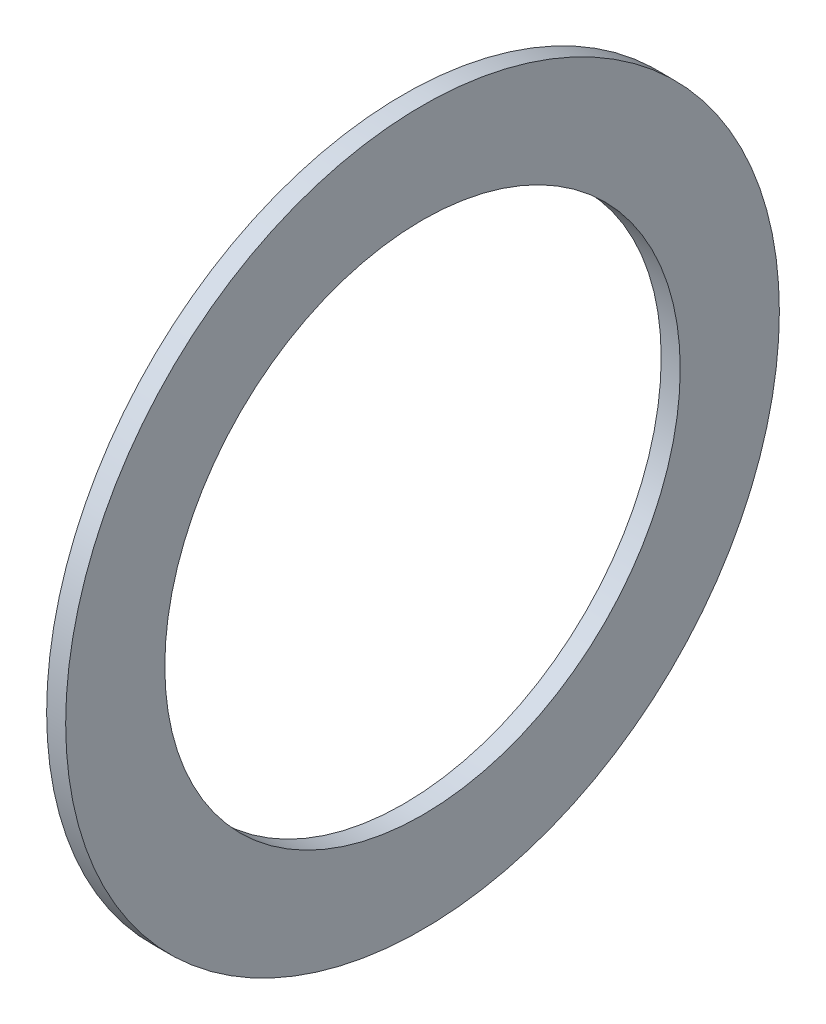
ISO-10303-21;
HEADER;
FILE_DESCRIPTION(('STEP AP214'),'2;1');
FILE_NAME('part.step','',(''),(''),'','','');
FILE_SCHEMA(('AUTOMOTIVE_DESIGN { 1 0 10303 214 1 1 1 1 }'));
ENDSEC;
DATA;
#1=APPLICATION_CONTEXT('core data for automotive mechanical design processes');
#2=APPLICATION_PROTOCOL_DEFINITION('international standard','automotive_design',2000,#1);
#3=PRODUCT_CONTEXT('',#1,'mechanical');
#4=PRODUCT('Part','Part','',(#3));
#5=PRODUCT_RELATED_PRODUCT_CATEGORY('part','',(#4));
#6=PRODUCT_DEFINITION_FORMATION('','',#4);
#7=PRODUCT_DEFINITION_CONTEXT('part definition',#1,'design');
#8=PRODUCT_DEFINITION('design','',#6,#7);
#9=PRODUCT_DEFINITION_SHAPE('','',#8);
#10=(LENGTH_UNIT() NAMED_UNIT(*) SI_UNIT(.MILLI.,.METRE.));
#11=(NAMED_UNIT(*) PLANE_ANGLE_UNIT() SI_UNIT($,.RADIAN.));
#12=(NAMED_UNIT(*) SI_UNIT($,.STERADIAN.) SOLID_ANGLE_UNIT());
#13=UNCERTAINTY_MEASURE_WITH_UNIT(LENGTH_MEASURE(1.E-05),#10,'distance_accuracy_value','');
#14=(GEOMETRIC_REPRESENTATION_CONTEXT(3) GLOBAL_UNCERTAINTY_ASSIGNED_CONTEXT((#13)) GLOBAL_UNIT_ASSIGNED_CONTEXT((#10,
#11,#12)) REPRESENTATION_CONTEXT('',''));
#15=CARTESIAN_POINT('',(0.,0.,0.));
#16=DIRECTION('',(0.,0.,1.));
#17=DIRECTION('',(1.,0.,0.));
#18=AXIS2_PLACEMENT_3D('',#15,#16,#17);
#19=CARTESIAN_POINT('',(1.2,-45.4986197219598,45.));
#20=DIRECTION('',(1.,0.,0.));
#21=DIRECTION('',(0.,0.,-1.));
#22=AXIS2_PLACEMENT_3D('',#19,#20,#21);
#23=PLANE('',#22);
#24=CARTESIAN_POINT('',(1.2,0.,0.));
#25=DIRECTION('',(1.,0.,0.));
#26=DIRECTION('',(0.,-1.1684785287495E-09,1.));
#27=AXIS2_PLACEMENT_3D('',#24,#25,#26);
#28=CIRCLE('',#27,45.);
#29=CARTESIAN_POINT('',(1.2,-5.25815337937274E-08,45.));
#30=VERTEX_POINT('',#29);
#31=EDGE_CURVE('E30',#30,#30,#28,.T.);
#32=ORIENTED_EDGE('',*,*,#31,.T.);
#33=EDGE_LOOP('',(#32));
#34=FACE_BOUND('',#33,.T.);
#35=CARTESIAN_POINT('',(1.2,0.,0.));
#36=DIRECTION('',(-1.,0.,0.));
#37=DIRECTION('',(0.,-1.16841887959778E-09,-1.));
#38=AXIS2_PLACEMENT_3D('',#35,#36,#37);
#39=CIRCLE('',#38,32.5);
#40=CARTESIAN_POINT('',(1.2,-3.7973613586928E-08,-32.5));
#41=VERTEX_POINT('',#40);
#42=EDGE_CURVE('E26',#41,#41,#39,.F.);
#43=ORIENTED_EDGE('',*,*,#42,.F.);
#44=EDGE_LOOP('',(#43));
#45=FACE_BOUND('',#44,.T.);
#46=ADVANCED_FACE('F15',(#34,#45),#23,.T.);
#47=CARTESIAN_POINT('',(-1.2,-45.4986197219598,45.));
#48=DIRECTION('',(-1.,0.,0.));
#49=DIRECTION('',(0.,1.,0.));
#50=AXIS2_PLACEMENT_3D('',#47,#48,#49);
#51=PLANE('',#50);
#52=CARTESIAN_POINT('',(-1.2,0.,0.));
#53=DIRECTION('',(-1.,0.,0.));
#54=DIRECTION('',(0.,-1.16847837085111E-09,-1.));
#55=AXIS2_PLACEMENT_3D('',#52,#53,#54);
#56=CIRCLE('',#55,45.);
#57=CARTESIAN_POINT('',(-1.2,-5.25815266883001E-08,-45.));
#58=VERTEX_POINT('',#57);
#59=EDGE_CURVE('E22',#58,#58,#56,.F.);
#60=ORIENTED_EDGE('',*,*,#59,.F.);
#61=EDGE_LOOP('',(#60));
#62=FACE_BOUND('',#61,.T.);
#63=CARTESIAN_POINT('',(-1.2,0.,0.));
#64=DIRECTION('',(1.,0.,0.));
#65=DIRECTION('',(0.,-1.16841866096925E-09,1.));
#66=AXIS2_PLACEMENT_3D('',#63,#64,#65);
#67=CIRCLE('',#66,32.5);
#68=CARTESIAN_POINT('',(-1.2,-3.79736064815006E-08,32.5));
#69=VERTEX_POINT('',#68);
#70=EDGE_CURVE('E10',#69,#69,#67,.T.);
#71=ORIENTED_EDGE('',*,*,#70,.T.);
#72=EDGE_LOOP('',(#71));
#73=FACE_BOUND('',#72,.T.);
#74=ADVANCED_FACE('F44',(#62,#73),#51,.T.);
#75=CARTESIAN_POINT('',(1.2,0.,0.));
#76=DIRECTION('',(-1.,0.,0.));
#77=DIRECTION('',(0.,0.,-1.));
#78=AXIS2_PLACEMENT_3D('',#75,#76,#77);
#79=CYLINDRICAL_SURFACE('',#78,32.5);
#80=ORIENTED_EDGE('',*,*,#42,.T.);
#81=EDGE_LOOP('',(#80));
#82=FACE_BOUND('',#81,.T.);
#83=ORIENTED_EDGE('',*,*,#70,.F.);
#84=EDGE_LOOP('',(#83));
#85=FACE_BOUND('',#84,.T.);
#86=ADVANCED_FACE('F39',(#82,#85),#79,.F.);
#87=CARTESIAN_POINT('',(1.2,0.,0.));
#88=DIRECTION('',(-1.,0.,0.));
#89=DIRECTION('',(0.,0.,-1.));
#90=AXIS2_PLACEMENT_3D('',#87,#88,#89);
#91=CYLINDRICAL_SURFACE('',#90,45.);
#92=ORIENTED_EDGE('',*,*,#31,.F.);
#93=EDGE_LOOP('',(#92));
#94=FACE_BOUND('',#93,.T.);
#95=ORIENTED_EDGE('',*,*,#59,.T.);
#96=EDGE_LOOP('',(#95));
#97=FACE_BOUND('',#96,.T.);
#98=ADVANCED_FACE('F17',(#94,#97),#91,.T.);
#99=CLOSED_SHELL('',(#46,#74,#86,#98));
#100=MANIFOLD_SOLID_BREP('B1',#99);
#101=ADVANCED_BREP_SHAPE_REPRESENTATION('',(#18,#100),#14);
#102=SHAPE_DEFINITION_REPRESENTATION(#9,#101);
ENDSEC;
END-ISO-10303-21;
